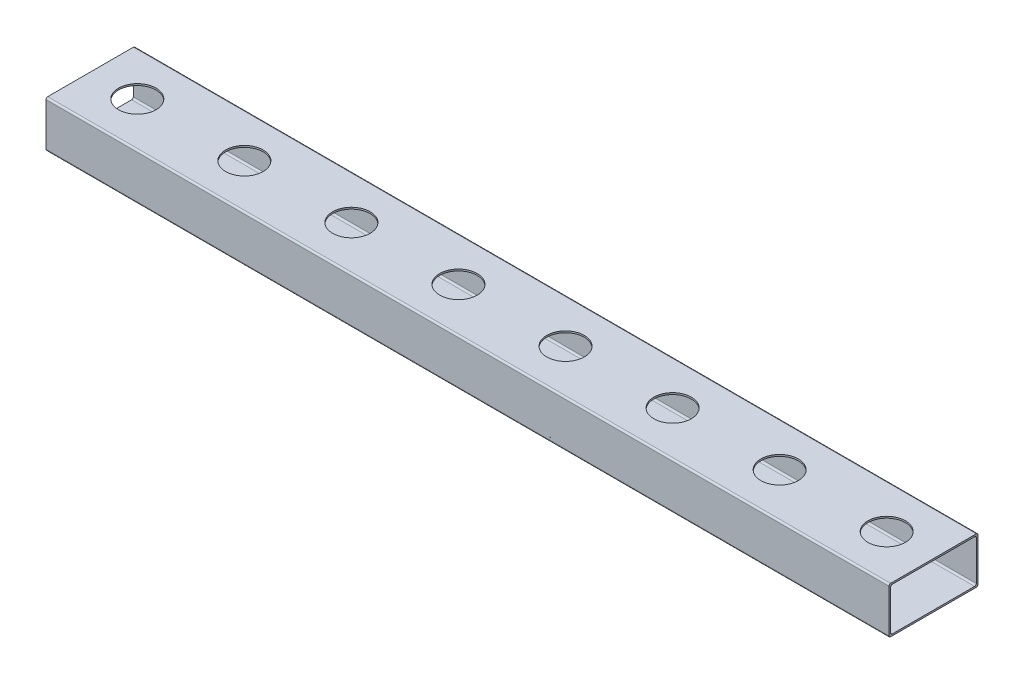
ISO-10303-21;
HEADER;
FILE_DESCRIPTION(('STEP AP214'),'2;1');
FILE_NAME('part.step','',(''),(''),'','','');
FILE_SCHEMA(('AUTOMOTIVE_DESIGN { 1 0 10303 214 1 1 1 1 }'));
ENDSEC;
DATA;
#1=APPLICATION_CONTEXT('core data for automotive mechanical design processes');
#2=APPLICATION_PROTOCOL_DEFINITION('international standard','automotive_design',2000,#1);
#3=PRODUCT_CONTEXT('',#1,'mechanical');
#4=PRODUCT('Part','Part','',(#3));
#5=PRODUCT_RELATED_PRODUCT_CATEGORY('part','',(#4));
#6=PRODUCT_DEFINITION_FORMATION('','',#4);
#7=PRODUCT_DEFINITION_CONTEXT('part definition',#1,'design');
#8=PRODUCT_DEFINITION('design','',#6,#7);
#9=PRODUCT_DEFINITION_SHAPE('','',#8);
#10=(LENGTH_UNIT() NAMED_UNIT(*) SI_UNIT(.MILLI.,.METRE.));
#11=(NAMED_UNIT(*) PLANE_ANGLE_UNIT() SI_UNIT($,.RADIAN.));
#12=(NAMED_UNIT(*) SI_UNIT($,.STERADIAN.) SOLID_ANGLE_UNIT());
#13=UNCERTAINTY_MEASURE_WITH_UNIT(LENGTH_MEASURE(1.E-05),#10,'distance_accuracy_value','');
#14=(GEOMETRIC_REPRESENTATION_CONTEXT(3) GLOBAL_UNCERTAINTY_ASSIGNED_CONTEXT((#13)) GLOBAL_UNIT_ASSIGNED_CONTEXT((#10,
#11,#12)) REPRESENTATION_CONTEXT('',''));
#15=CARTESIAN_POINT('',(0.,0.,0.));
#16=DIRECTION('',(0.,0.,1.));
#17=DIRECTION('',(1.,0.,0.));
#18=AXIS2_PLACEMENT_3D('',#15,#16,#17);
#19=CARTESIAN_POINT('',(500.,27.5,50.85));
#20=DIRECTION('',(0.,-1.,0.));
#21=DIRECTION('',(0.,0.,-1.));
#22=AXIS2_PLACEMENT_3D('',#19,#20,#21);
#23=PLANE('',#22);
#24=CARTESIAN_POINT('',(-190.5,27.5,0.));
#25=DIRECTION('',(0.,1.,0.));
#26=DIRECTION('',(0.,0.,1.));
#27=AXIS2_PLACEMENT_3D('',#24,#25,#26);
#28=CIRCLE('',#27,22.25);
#29=CARTESIAN_POINT('',(-190.5,27.5,22.25));
#30=VERTEX_POINT('',#29);
#31=EDGE_CURVE('E565',#30,#30,#28,.T.);
#32=ORIENTED_EDGE('',*,*,#31,.F.);
#33=EDGE_LOOP('',(#32));
#34=FACE_BOUND('',#33,.T.);
#35=CARTESIAN_POINT('',(63.5,27.5,0.));
#36=DIRECTION('',(0.,1.,0.));
#37=DIRECTION('',(0.,0.,1.));
#38=AXIS2_PLACEMENT_3D('',#35,#36,#37);
#39=CIRCLE('',#38,22.25);
#40=CARTESIAN_POINT('',(63.5,27.5,22.25));
#41=VERTEX_POINT('',#40);
#42=EDGE_CURVE('E577',#41,#41,#39,.T.);
#43=ORIENTED_EDGE('',*,*,#42,.F.);
#44=EDGE_LOOP('',(#43));
#45=FACE_BOUND('',#44,.T.);
#46=CARTESIAN_POINT('',(190.5,27.5,0.));
#47=DIRECTION('',(0.,1.,0.));
#48=DIRECTION('',(0.,0.,1.));
#49=AXIS2_PLACEMENT_3D('',#46,#47,#48);
#50=CIRCLE('',#49,22.25);
#51=CARTESIAN_POINT('',(190.5,27.5,22.25));
#52=VERTEX_POINT('',#51);
#53=EDGE_CURVE('E583',#52,#52,#50,.T.);
#54=ORIENTED_EDGE('',*,*,#53,.F.);
#55=EDGE_LOOP('',(#54));
#56=FACE_BOUND('',#55,.T.);
#57=DIRECTION('',(0.,0.,1.));
#58=VECTOR('',#57,1.);
#59=CARTESIAN_POINT('',(-500.,27.5,50.85));
#60=LINE('',#59,#58);
#61=CARTESIAN_POINT('',(-500.,27.5,-50.85));
#62=VERTEX_POINT('',#61);
#63=CARTESIAN_POINT('',(-500.,27.5,50.85));
#64=VERTEX_POINT('',#63);
#65=EDGE_CURVE('E241',#62,#64,#60,.T.);
#66=ORIENTED_EDGE('',*,*,#65,.T.);
#67=DIRECTION('',(-1.,0.,0.));
#68=VECTOR('',#67,1.);
#69=CARTESIAN_POINT('',(500.,27.5,50.85));
#70=LINE('',#69,#68);
#71=CARTESIAN_POINT('',(500.,27.5,50.85));
#72=VERTEX_POINT('',#71);
#73=EDGE_CURVE('E47',#72,#64,#70,.T.);
#74=ORIENTED_EDGE('',*,*,#73,.F.);
#75=DIRECTION('',(0.,0.,1.));
#76=VECTOR('',#75,1.);
#77=CARTESIAN_POINT('',(500.,27.5,50.85));
#78=LINE('',#77,#76);
#79=CARTESIAN_POINT('',(500.,27.5,-50.85));
#80=VERTEX_POINT('',#79);
#81=EDGE_CURVE('E223',#80,#72,#78,.T.);
#82=ORIENTED_EDGE('',*,*,#81,.F.);
#83=DIRECTION('',(-1.,0.,0.));
#84=VECTOR('',#83,1.);
#85=CARTESIAN_POINT('',(500.,27.5,-50.85));
#86=LINE('',#85,#84);
#87=EDGE_CURVE('E11',#80,#62,#86,.T.);
#88=ORIENTED_EDGE('',*,*,#87,.T.);
#89=EDGE_LOOP('',(#66,#74,#82,#88));
#90=FACE_BOUND('',#89,.T.);
#91=CARTESIAN_POINT('',(444.5,27.5,0.));
#92=DIRECTION('',(0.,1.,0.));
#93=DIRECTION('',(0.,0.,1.));
#94=AXIS2_PLACEMENT_3D('',#91,#92,#93);
#95=CIRCLE('',#94,22.25);
#96=CARTESIAN_POINT('',(444.5,27.5,22.25));
#97=VERTEX_POINT('',#96);
#98=EDGE_CURVE('E595',#97,#97,#95,.T.);
#99=ORIENTED_EDGE('',*,*,#98,.F.);
#100=EDGE_LOOP('',(#99));
#101=FACE_BOUND('',#100,.T.);
#102=CARTESIAN_POINT('',(317.5,27.5,0.));
#103=DIRECTION('',(0.,1.,0.));
#104=DIRECTION('',(0.,0.,1.));
#105=AXIS2_PLACEMENT_3D('',#102,#103,#104);
#106=CIRCLE('',#105,22.25);
#107=CARTESIAN_POINT('',(317.5,27.5,22.25));
#108=VERTEX_POINT('',#107);
#109=EDGE_CURVE('E589',#108,#108,#106,.T.);
#110=ORIENTED_EDGE('',*,*,#109,.F.);
#111=EDGE_LOOP('',(#110));
#112=FACE_BOUND('',#111,.T.);
#113=CARTESIAN_POINT('',(-63.5,27.5,0.));
#114=DIRECTION('',(0.,1.,0.));
#115=DIRECTION('',(0.,0.,1.));
#116=AXIS2_PLACEMENT_3D('',#113,#114,#115);
#117=CIRCLE('',#116,22.25);
#118=CARTESIAN_POINT('',(-63.5,27.5,22.25));
#119=VERTEX_POINT('',#118);
#120=EDGE_CURVE('E571',#119,#119,#117,.T.);
#121=ORIENTED_EDGE('',*,*,#120,.F.);
#122=EDGE_LOOP('',(#121));
#123=FACE_BOUND('',#122,.T.);
#124=CARTESIAN_POINT('',(-317.5,27.5,0.));
#125=DIRECTION('',(0.,1.,0.));
#126=DIRECTION('',(0.,0.,1.));
#127=AXIS2_PLACEMENT_3D('',#124,#125,#126);
#128=CIRCLE('',#127,22.25);
#129=CARTESIAN_POINT('',(-317.5,27.5,22.25));
#130=VERTEX_POINT('',#129);
#131=EDGE_CURVE('E556',#130,#130,#128,.T.);
#132=ORIENTED_EDGE('',*,*,#131,.F.);
#133=EDGE_LOOP('',(#132));
#134=FACE_BOUND('',#133,.T.);
#135=CARTESIAN_POINT('',(-444.5,27.5,0.));
#136=DIRECTION('',(0.,1.,0.));
#137=DIRECTION('',(0.,0.,1.));
#138=AXIS2_PLACEMENT_3D('',#135,#136,#137);
#139=CIRCLE('',#138,22.25);
#140=CARTESIAN_POINT('',(-444.5,27.5,22.25));
#141=VERTEX_POINT('',#140);
#142=EDGE_CURVE('E552',#141,#141,#139,.T.);
#143=ORIENTED_EDGE('',*,*,#142,.F.);
#144=EDGE_LOOP('',(#143));
#145=FACE_BOUND('',#144,.T.);
#146=ADVANCED_FACE('F39',(#34,#45,#56,#90,#101,#112,#123,#134,#145),#23,.F.);
#147=CARTESIAN_POINT('',(500.,25.5,-50.85));
#148=DIRECTION('',(-1.,0.,0.));
#149=DIRECTION('',(0.,0.,1.));
#150=AXIS2_PLACEMENT_3D('',#147,#148,#149);
#151=PLANE('',#150);
#152=CARTESIAN_POINT('',(500.,25.5,-50.85));
#153=DIRECTION('',(1.,0.,0.));
#154=DIRECTION('',(0.,0.,1.));
#155=AXIS2_PLACEMENT_3D('',#152,#153,#154);
#156=CIRCLE('',#155,2.);
#157=CARTESIAN_POINT('',(500.,25.5,-52.85));
#158=VERTEX_POINT('',#157);
#159=EDGE_CURVE('E220',#158,#80,#156,.T.);
#160=ORIENTED_EDGE('',*,*,#159,.T.);
#161=ORIENTED_EDGE('',*,*,#81,.T.);
#162=CARTESIAN_POINT('',(500.,25.5,50.85));
#163=DIRECTION('',(1.,0.,0.));
#164=DIRECTION('',(0.,0.,1.));
#165=AXIS2_PLACEMENT_3D('',#162,#163,#164);
#166=CIRCLE('',#165,2.);
#167=CARTESIAN_POINT('',(500.,25.5,52.85));
#168=VERTEX_POINT('',#167);
#169=EDGE_CURVE('E226',#72,#168,#166,.T.);
#170=ORIENTED_EDGE('',*,*,#169,.T.);
#171=DIRECTION('',(0.,-1.,0.));
#172=VECTOR('',#171,1.);
#173=CARTESIAN_POINT('',(500.,-25.5,52.85));
#174=LINE('',#173,#172);
#175=CARTESIAN_POINT('',(500.,-25.5,52.85));
#176=VERTEX_POINT('',#175);
#177=EDGE_CURVE('E228',#168,#176,#174,.T.);
#178=ORIENTED_EDGE('',*,*,#177,.T.);
#179=CARTESIAN_POINT('',(500.,-25.5,50.85));
#180=DIRECTION('',(1.,0.,0.));
#181=DIRECTION('',(0.,0.,1.));
#182=AXIS2_PLACEMENT_3D('',#179,#180,#181);
#183=CIRCLE('',#182,2.);
#184=CARTESIAN_POINT('',(500.,-27.5,50.85));
#185=VERTEX_POINT('',#184);
#186=EDGE_CURVE('E230',#176,#185,#183,.T.);
#187=ORIENTED_EDGE('',*,*,#186,.T.);
#188=DIRECTION('',(0.,0.,-1.));
#189=VECTOR('',#188,1.);
#190=CARTESIAN_POINT('',(500.,-27.5,50.85));
#191=LINE('',#190,#189);
#192=CARTESIAN_POINT('',(500.,-27.5,-50.85));
#193=VERTEX_POINT('',#192);
#194=EDGE_CURVE('E232',#185,#193,#191,.T.);
#195=ORIENTED_EDGE('',*,*,#194,.T.);
#196=CARTESIAN_POINT('',(500.,-25.5,-50.85));
#197=DIRECTION('',(1.,0.,0.));
#198=DIRECTION('',(0.,0.,-1.));
#199=AXIS2_PLACEMENT_3D('',#196,#197,#198);
#200=CIRCLE('',#199,2.);
#201=CARTESIAN_POINT('',(500.,-25.5,-52.85));
#202=VERTEX_POINT('',#201);
#203=EDGE_CURVE('E234',#193,#202,#200,.T.);
#204=ORIENTED_EDGE('',*,*,#203,.T.);
#205=DIRECTION('',(0.,1.,0.));
#206=VECTOR('',#205,1.);
#207=CARTESIAN_POINT('',(500.,-25.5,-52.85));
#208=LINE('',#207,#206);
#209=EDGE_CURVE('E236',#202,#158,#208,.T.);
#210=ORIENTED_EDGE('',*,*,#209,.T.);
#211=EDGE_LOOP('',(#160,#161,#170,#178,#187,#195,#204,#210));
#212=FACE_BOUND('',#211,.T.);
#213=CARTESIAN_POINT('',(500.,23.5,-48.85));
#214=DIRECTION('',(1.,0.,0.));
#215=DIRECTION('',(0.,0.,1.));
#216=AXIS2_PLACEMENT_3D('',#213,#214,#215);
#217=CIRCLE('',#216,2.00000000000001);
#218=CARTESIAN_POINT('',(500.,23.5,-50.85));
#219=VERTEX_POINT('',#218);
#220=CARTESIAN_POINT('',(500.,25.5,-48.85));
#221=VERTEX_POINT('',#220);
#222=EDGE_CURVE('E152',#219,#221,#217,.T.);
#223=ORIENTED_EDGE('',*,*,#222,.F.);
#224=DIRECTION('',(0.,1.,0.));
#225=VECTOR('',#224,1.);
#226=CARTESIAN_POINT('',(500.,-23.5,-50.85));
#227=LINE('',#226,#225);
#228=CARTESIAN_POINT('',(500.,-23.5,-50.85));
#229=VERTEX_POINT('',#228);
#230=EDGE_CURVE('E187',#229,#219,#227,.T.);
#231=ORIENTED_EDGE('',*,*,#230,.F.);
#232=CARTESIAN_POINT('',(500.,-23.5,-48.85));
#233=DIRECTION('',(1.,0.,0.));
#234=DIRECTION('',(0.,0.,1.));
#235=AXIS2_PLACEMENT_3D('',#232,#233,#234);
#236=CIRCLE('',#235,2.00000000000001);
#237=CARTESIAN_POINT('',(500.,-25.5,-48.85));
#238=VERTEX_POINT('',#237);
#239=EDGE_CURVE('E185',#238,#229,#236,.T.);
#240=ORIENTED_EDGE('',*,*,#239,.F.);
#241=DIRECTION('',(0.,0.,-1.));
#242=VECTOR('',#241,1.);
#243=CARTESIAN_POINT('',(500.,-25.5,48.85));
#244=LINE('',#243,#242);
#245=CARTESIAN_POINT('',(500.,-25.5,48.85));
#246=VERTEX_POINT('',#245);
#247=EDGE_CURVE('E183',#246,#238,#244,.T.);
#248=ORIENTED_EDGE('',*,*,#247,.F.);
#249=CARTESIAN_POINT('',(500.,-23.5,48.85));
#250=DIRECTION('',(1.,0.,0.));
#251=DIRECTION('',(0.,0.,1.));
#252=AXIS2_PLACEMENT_3D('',#249,#250,#251);
#253=CIRCLE('',#252,2.);
#254=CARTESIAN_POINT('',(500.,-23.5,50.85));
#255=VERTEX_POINT('',#254);
#256=EDGE_CURVE('E181',#255,#246,#253,.T.);
#257=ORIENTED_EDGE('',*,*,#256,.F.);
#258=DIRECTION('',(0.,-1.,0.));
#259=VECTOR('',#258,1.);
#260=CARTESIAN_POINT('',(500.,-23.5,50.85));
#261=LINE('',#260,#259);
#262=CARTESIAN_POINT('',(500.,23.5,50.85));
#263=VERTEX_POINT('',#262);
#264=EDGE_CURVE('E176',#263,#255,#261,.T.);
#265=ORIENTED_EDGE('',*,*,#264,.F.);
#266=CARTESIAN_POINT('',(500.,23.5,48.85));
#267=DIRECTION('',(1.,0.,0.));
#268=DIRECTION('',(0.,0.,-1.));
#269=AXIS2_PLACEMENT_3D('',#266,#267,#268);
#270=CIRCLE('',#269,2.);
#271=CARTESIAN_POINT('',(500.,25.5,48.85));
#272=VERTEX_POINT('',#271);
#273=EDGE_CURVE('E174',#272,#263,#270,.T.);
#274=ORIENTED_EDGE('',*,*,#273,.F.);
#275=DIRECTION('',(0.,0.,1.));
#276=VECTOR('',#275,1.);
#277=CARTESIAN_POINT('',(500.,25.5,48.85));
#278=LINE('',#277,#276);
#279=EDGE_CURVE('E160',#221,#272,#278,.T.);
#280=ORIENTED_EDGE('',*,*,#279,.F.);
#281=EDGE_LOOP('',(#223,#231,#240,#248,#257,#265,#274,#280));
#282=FACE_BOUND('',#281,.T.);
#283=ADVANCED_FACE('F172',(#212,#282),#151,.F.);
#284=CARTESIAN_POINT('',(-500.,25.5,-50.85));
#285=DIRECTION('',(-1.,0.,0.));
#286=DIRECTION('',(0.,0.,1.));
#287=AXIS2_PLACEMENT_3D('',#284,#285,#286);
#288=PLANE('',#287);
#289=CARTESIAN_POINT('',(-500.,25.5,-50.85));
#290=DIRECTION('',(1.,0.,0.));
#291=DIRECTION('',(0.,0.,1.));
#292=AXIS2_PLACEMENT_3D('',#289,#290,#291);
#293=CIRCLE('',#292,2.);
#294=CARTESIAN_POINT('',(-500.,25.5,-52.85));
#295=VERTEX_POINT('',#294);
#296=EDGE_CURVE('E168',#295,#62,#293,.T.);
#297=ORIENTED_EDGE('',*,*,#296,.F.);
#298=DIRECTION('',(0.,1.,0.));
#299=VECTOR('',#298,1.);
#300=CARTESIAN_POINT('',(-500.,-25.5,-52.85));
#301=LINE('',#300,#299);
#302=CARTESIAN_POINT('',(-500.,-25.5,-52.85));
#303=VERTEX_POINT('',#302);
#304=EDGE_CURVE('E224',#303,#295,#301,.T.);
#305=ORIENTED_EDGE('',*,*,#304,.F.);
#306=CARTESIAN_POINT('',(-500.,-25.5,-50.85));
#307=DIRECTION('',(1.,0.,0.));
#308=DIRECTION('',(0.,0.,-1.));
#309=AXIS2_PLACEMENT_3D('',#306,#307,#308);
#310=CIRCLE('',#309,2.);
#311=CARTESIAN_POINT('',(-500.,-27.5,-50.85));
#312=VERTEX_POINT('',#311);
#313=EDGE_CURVE('E251',#312,#303,#310,.T.);
#314=ORIENTED_EDGE('',*,*,#313,.F.);
#315=DIRECTION('',(0.,0.,-1.));
#316=VECTOR('',#315,1.);
#317=CARTESIAN_POINT('',(-500.,-27.5,50.85));
#318=LINE('',#317,#316);
#319=CARTESIAN_POINT('',(-500.,-27.5,50.85));
#320=VERTEX_POINT('',#319);
#321=EDGE_CURVE('E249',#320,#312,#318,.T.);
#322=ORIENTED_EDGE('',*,*,#321,.F.);
#323=CARTESIAN_POINT('',(-500.,-25.5,50.85));
#324=DIRECTION('',(1.,0.,0.));
#325=DIRECTION('',(0.,0.,1.));
#326=AXIS2_PLACEMENT_3D('',#323,#324,#325);
#327=CIRCLE('',#326,2.);
#328=CARTESIAN_POINT('',(-500.,-25.5,52.85));
#329=VERTEX_POINT('',#328);
#330=EDGE_CURVE('E247',#329,#320,#327,.T.);
#331=ORIENTED_EDGE('',*,*,#330,.F.);
#332=DIRECTION('',(0.,-1.,0.));
#333=VECTOR('',#332,1.);
#334=CARTESIAN_POINT('',(-500.,-25.5,52.85));
#335=LINE('',#334,#333);
#336=CARTESIAN_POINT('',(-500.,25.5,52.85));
#337=VERTEX_POINT('',#336);
#338=EDGE_CURVE('E245',#337,#329,#335,.T.);
#339=ORIENTED_EDGE('',*,*,#338,.F.);
#340=CARTESIAN_POINT('',(-500.,25.5,50.85));
#341=DIRECTION('',(1.,0.,0.));
#342=DIRECTION('',(0.,0.,1.));
#343=AXIS2_PLACEMENT_3D('',#340,#341,#342);
#344=CIRCLE('',#343,2.);
#345=EDGE_CURVE('E243',#64,#337,#344,.T.);
#346=ORIENTED_EDGE('',*,*,#345,.F.);
#347=ORIENTED_EDGE('',*,*,#65,.F.);
#348=EDGE_LOOP('',(#297,#305,#314,#322,#331,#339,#346,#347));
#349=FACE_BOUND('',#348,.T.);
#350=DIRECTION('',(0.,1.,0.));
#351=VECTOR('',#350,1.);
#352=CARTESIAN_POINT('',(-500.,-23.5,-50.85));
#353=LINE('',#352,#351);
#354=CARTESIAN_POINT('',(-500.,-23.5,-50.85));
#355=VERTEX_POINT('',#354);
#356=CARTESIAN_POINT('',(-500.,23.5,-50.85));
#357=VERTEX_POINT('',#356);
#358=EDGE_CURVE('E161',#355,#357,#353,.T.);
#359=ORIENTED_EDGE('',*,*,#358,.T.);
#360=CARTESIAN_POINT('',(-500.,23.5,-48.85));
#361=DIRECTION('',(1.,0.,0.));
#362=DIRECTION('',(0.,0.,1.));
#363=AXIS2_PLACEMENT_3D('',#360,#361,#362);
#364=CIRCLE('',#363,2.00000000000001);
#365=CARTESIAN_POINT('',(-500.,25.5,-48.85));
#366=VERTEX_POINT('',#365);
#367=EDGE_CURVE('E62',#357,#366,#364,.T.);
#368=ORIENTED_EDGE('',*,*,#367,.T.);
#369=DIRECTION('',(0.,0.,1.));
#370=VECTOR('',#369,1.);
#371=CARTESIAN_POINT('',(-500.,25.5,48.85));
#372=LINE('',#371,#370);
#373=CARTESIAN_POINT('',(-500.,25.5,48.85));
#374=VERTEX_POINT('',#373);
#375=EDGE_CURVE('E167',#366,#374,#372,.T.);
#376=ORIENTED_EDGE('',*,*,#375,.T.);
#377=CARTESIAN_POINT('',(-500.,23.5,48.85));
#378=DIRECTION('',(1.,0.,0.));
#379=DIRECTION('',(0.,0.,-1.));
#380=AXIS2_PLACEMENT_3D('',#377,#378,#379);
#381=CIRCLE('',#380,2.);
#382=CARTESIAN_POINT('',(-500.,23.5,50.85));
#383=VERTEX_POINT('',#382);
#384=EDGE_CURVE('E192',#374,#383,#381,.T.);
#385=ORIENTED_EDGE('',*,*,#384,.T.);
#386=DIRECTION('',(0.,-1.,0.));
#387=VECTOR('',#386,1.);
#388=CARTESIAN_POINT('',(-500.,-23.5,50.85));
#389=LINE('',#388,#387);
#390=CARTESIAN_POINT('',(-500.,-23.5,50.85));
#391=VERTEX_POINT('',#390);
#392=EDGE_CURVE('E195',#383,#391,#389,.T.);
#393=ORIENTED_EDGE('',*,*,#392,.T.);
#394=CARTESIAN_POINT('',(-500.,-23.5,48.85));
#395=DIRECTION('',(1.,0.,0.));
#396=DIRECTION('',(0.,0.,1.));
#397=AXIS2_PLACEMENT_3D('',#394,#395,#396);
#398=CIRCLE('',#397,2.);
#399=CARTESIAN_POINT('',(-500.,-25.5,48.85));
#400=VERTEX_POINT('',#399);
#401=EDGE_CURVE('E198',#391,#400,#398,.T.);
#402=ORIENTED_EDGE('',*,*,#401,.T.);
#403=DIRECTION('',(0.,0.,-1.));
#404=VECTOR('',#403,1.);
#405=CARTESIAN_POINT('',(-500.,-25.5,48.85));
#406=LINE('',#405,#404);
#407=CARTESIAN_POINT('',(-500.,-25.5,-48.85));
#408=VERTEX_POINT('',#407);
#409=EDGE_CURVE('E201',#400,#408,#406,.T.);
#410=ORIENTED_EDGE('',*,*,#409,.T.);
#411=CARTESIAN_POINT('',(-500.,-23.5,-48.85));
#412=DIRECTION('',(1.,0.,0.));
#413=DIRECTION('',(0.,0.,1.));
#414=AXIS2_PLACEMENT_3D('',#411,#412,#413);
#415=CIRCLE('',#414,2.00000000000001);
#416=EDGE_CURVE('E204',#408,#355,#415,.T.);
#417=ORIENTED_EDGE('',*,*,#416,.T.);
#418=EDGE_LOOP('',(#359,#368,#376,#385,#393,#402,#410,#417));
#419=FACE_BOUND('',#418,.T.);
#420=ADVANCED_FACE('F281',(#349,#419),#288,.T.);
#421=CARTESIAN_POINT('',(500.,25.5,-50.85));
#422=DIRECTION('',(-1.,0.,0.));
#423=DIRECTION('',(0.,0.,1.));
#424=AXIS2_PLACEMENT_3D('',#421,#422,#423);
#425=CYLINDRICAL_SURFACE('',#424,2.);
#426=ORIENTED_EDGE('',*,*,#296,.T.);
#427=ORIENTED_EDGE('',*,*,#87,.F.);
#428=ORIENTED_EDGE('',*,*,#159,.F.);
#429=DIRECTION('',(-1.,0.,0.));
#430=VECTOR('',#429,1.);
#431=CARTESIAN_POINT('',(500.,25.5,-52.85));
#432=LINE('',#431,#430);
#433=EDGE_CURVE('E238',#158,#295,#432,.T.);
#434=ORIENTED_EDGE('',*,*,#433,.T.);
#435=EDGE_LOOP('',(#426,#427,#428,#434));
#436=FACE_BOUND('',#435,.T.);
#437=ADVANCED_FACE('F41',(#436),#425,.T.);
#438=CARTESIAN_POINT('',(500.,25.5,50.85));
#439=DIRECTION('',(-1.,0.,0.));
#440=DIRECTION('',(0.,0.,1.));
#441=AXIS2_PLACEMENT_3D('',#438,#439,#440);
#442=CYLINDRICAL_SURFACE('',#441,2.);
#443=ORIENTED_EDGE('',*,*,#345,.T.);
#444=DIRECTION('',(-1.,0.,0.));
#445=VECTOR('',#444,1.);
#446=CARTESIAN_POINT('',(500.,25.5,52.85));
#447=LINE('',#446,#445);
#448=EDGE_CURVE('E268',#168,#337,#447,.T.);
#449=ORIENTED_EDGE('',*,*,#448,.F.);
#450=ORIENTED_EDGE('',*,*,#169,.F.);
#451=ORIENTED_EDGE('',*,*,#73,.T.);
#452=EDGE_LOOP('',(#443,#449,#450,#451));
#453=FACE_BOUND('',#452,.T.);
#454=ADVANCED_FACE('F275',(#453),#442,.T.);
#455=CARTESIAN_POINT('',(500.,-25.5,52.85));
#456=DIRECTION('',(0.,0.,-1.));
#457=DIRECTION('',(-1.,0.,0.));
#458=AXIS2_PLACEMENT_3D('',#455,#456,#457);
#459=PLANE('',#458);
#460=ORIENTED_EDGE('',*,*,#338,.T.);
#461=DIRECTION('',(-1.,0.,0.));
#462=VECTOR('',#461,1.);
#463=CARTESIAN_POINT('',(500.,-25.5,52.85));
#464=LINE('',#463,#462);
#465=EDGE_CURVE('E265',#176,#329,#464,.T.);
#466=ORIENTED_EDGE('',*,*,#465,.F.);
#467=ORIENTED_EDGE('',*,*,#177,.F.);
#468=ORIENTED_EDGE('',*,*,#448,.T.);
#469=EDGE_LOOP('',(#460,#466,#467,#468));
#470=FACE_BOUND('',#469,.T.);
#471=ADVANCED_FACE('F287',(#470),#459,.F.);
#472=CARTESIAN_POINT('',(500.,-25.5,50.85));
#473=DIRECTION('',(-1.,0.,0.));
#474=DIRECTION('',(0.,0.,1.));
#475=AXIS2_PLACEMENT_3D('',#472,#473,#474);
#476=CYLINDRICAL_SURFACE('',#475,2.);
#477=ORIENTED_EDGE('',*,*,#330,.T.);
#478=DIRECTION('',(-1.,0.,0.));
#479=VECTOR('',#478,1.);
#480=CARTESIAN_POINT('',(500.,-27.5,50.85));
#481=LINE('',#480,#479);
#482=EDGE_CURVE('E262',#185,#320,#481,.T.);
#483=ORIENTED_EDGE('',*,*,#482,.F.);
#484=ORIENTED_EDGE('',*,*,#186,.F.);
#485=ORIENTED_EDGE('',*,*,#465,.T.);
#486=EDGE_LOOP('',(#477,#483,#484,#485));
#487=FACE_BOUND('',#486,.T.);
#488=ADVANCED_FACE('F291',(#487),#476,.T.);
#489=CARTESIAN_POINT('',(500.,-27.5,50.85));
#490=DIRECTION('',(0.,1.,0.));
#491=DIRECTION('',(0.,0.,1.));
#492=AXIS2_PLACEMENT_3D('',#489,#490,#491);
#493=PLANE('',#492);
#494=ORIENTED_EDGE('',*,*,#321,.T.);
#495=DIRECTION('',(-1.,0.,0.));
#496=VECTOR('',#495,1.);
#497=CARTESIAN_POINT('',(500.,-27.5,-50.85));
#498=LINE('',#497,#496);
#499=EDGE_CURVE('E259',#193,#312,#498,.T.);
#500=ORIENTED_EDGE('',*,*,#499,.F.);
#501=ORIENTED_EDGE('',*,*,#194,.F.);
#502=ORIENTED_EDGE('',*,*,#482,.T.);
#503=EDGE_LOOP('',(#494,#500,#501,#502));
#504=FACE_BOUND('',#503,.T.);
#505=ADVANCED_FACE('F311',(#504),#493,.F.);
#506=CARTESIAN_POINT('',(500.,-25.5,-50.85));
#507=DIRECTION('',(-1.,0.,0.));
#508=DIRECTION('',(0.,0.,1.));
#509=AXIS2_PLACEMENT_3D('',#506,#507,#508);
#510=CYLINDRICAL_SURFACE('',#509,2.);
#511=ORIENTED_EDGE('',*,*,#313,.T.);
#512=DIRECTION('',(-1.,0.,0.));
#513=VECTOR('',#512,1.);
#514=CARTESIAN_POINT('',(500.,-25.5,-52.85));
#515=LINE('',#514,#513);
#516=EDGE_CURVE('E256',#202,#303,#515,.T.);
#517=ORIENTED_EDGE('',*,*,#516,.F.);
#518=ORIENTED_EDGE('',*,*,#203,.F.);
#519=ORIENTED_EDGE('',*,*,#499,.T.);
#520=EDGE_LOOP('',(#511,#517,#518,#519));
#521=FACE_BOUND('',#520,.T.);
#522=ADVANCED_FACE('F309',(#521),#510,.T.);
#523=CARTESIAN_POINT('',(500.,-25.5,-52.85));
#524=DIRECTION('',(0.,0.,1.));
#525=DIRECTION('',(1.,0.,0.));
#526=AXIS2_PLACEMENT_3D('',#523,#524,#525);
#527=PLANE('',#526);
#528=ORIENTED_EDGE('',*,*,#304,.T.);
#529=ORIENTED_EDGE('',*,*,#433,.F.);
#530=ORIENTED_EDGE('',*,*,#209,.F.);
#531=ORIENTED_EDGE('',*,*,#516,.T.);
#532=EDGE_LOOP('',(#528,#529,#530,#531));
#533=FACE_BOUND('',#532,.T.);
#534=ADVANCED_FACE('F304',(#533),#527,.F.);
#535=CARTESIAN_POINT('',(500.,23.5,-48.85));
#536=DIRECTION('',(-1.,0.,0.));
#537=DIRECTION('',(0.,0.,1.));
#538=AXIS2_PLACEMENT_3D('',#535,#536,#537);
#539=CYLINDRICAL_SURFACE('',#538,2.00000000000001);
#540=ORIENTED_EDGE('',*,*,#367,.F.);
#541=DIRECTION('',(-1.,0.,0.));
#542=VECTOR('',#541,1.);
#543=CARTESIAN_POINT('',(500.,23.5,-50.85));
#544=LINE('',#543,#542);
#545=EDGE_CURVE('E156',#219,#357,#544,.T.);
#546=ORIENTED_EDGE('',*,*,#545,.F.);
#547=ORIENTED_EDGE('',*,*,#222,.T.);
#548=DIRECTION('',(-1.,0.,0.));
#549=VECTOR('',#548,1.);
#550=CARTESIAN_POINT('',(500.,25.5,-48.85));
#551=LINE('',#550,#549);
#552=EDGE_CURVE('E155',#221,#366,#551,.T.);
#553=ORIENTED_EDGE('',*,*,#552,.T.);
#554=EDGE_LOOP('',(#540,#546,#547,#553));
#555=FACE_BOUND('',#554,.T.);
#556=ADVANCED_FACE('F154',(#555),#539,.F.);
#557=CARTESIAN_POINT('',(500.,25.5,48.85));
#558=DIRECTION('',(0.,-1.,0.));
#559=DIRECTION('',(0.,0.,-1.));
#560=AXIS2_PLACEMENT_3D('',#557,#558,#559);
#561=PLANE('',#560);
#562=CARTESIAN_POINT('',(-444.5,25.5,0.));
#563=DIRECTION('',(0.,-1.,0.));
#564=DIRECTION('',(0.,0.,-1.));
#565=AXIS2_PLACEMENT_3D('',#562,#563,#564);
#566=CIRCLE('',#565,22.25);
#567=CARTESIAN_POINT('',(-444.5,25.5,-22.25));
#568=VERTEX_POINT('',#567);
#569=EDGE_CURVE('E555',#568,#568,#566,.T.);
#570=ORIENTED_EDGE('',*,*,#569,.F.);
#571=EDGE_LOOP('',(#570));
#572=FACE_BOUND('',#571,.T.);
#573=CARTESIAN_POINT('',(-317.5,25.5,0.));
#574=DIRECTION('',(0.,-1.,0.));
#575=DIRECTION('',(0.,0.,-1.));
#576=AXIS2_PLACEMENT_3D('',#573,#574,#575);
#577=CIRCLE('',#576,22.25);
#578=CARTESIAN_POINT('',(-317.5,25.5,-22.25));
#579=VERTEX_POINT('',#578);
#580=EDGE_CURVE('E559',#579,#579,#577,.T.);
#581=ORIENTED_EDGE('',*,*,#580,.F.);
#582=EDGE_LOOP('',(#581));
#583=FACE_BOUND('',#582,.T.);
#584=CARTESIAN_POINT('',(-190.5,25.5,0.));
#585=DIRECTION('',(0.,-1.,0.));
#586=DIRECTION('',(0.,0.,-1.));
#587=AXIS2_PLACEMENT_3D('',#584,#585,#586);
#588=CIRCLE('',#587,22.25);
#589=CARTESIAN_POINT('',(-190.5,25.5,-22.25));
#590=VERTEX_POINT('',#589);
#591=EDGE_CURVE('E568',#590,#590,#588,.T.);
#592=ORIENTED_EDGE('',*,*,#591,.F.);
#593=EDGE_LOOP('',(#592));
#594=FACE_BOUND('',#593,.T.);
#595=CARTESIAN_POINT('',(-63.5,25.5,0.));
#596=DIRECTION('',(0.,-1.,0.));
#597=DIRECTION('',(0.,0.,-1.));
#598=AXIS2_PLACEMENT_3D('',#595,#596,#597);
#599=CIRCLE('',#598,22.25);
#600=CARTESIAN_POINT('',(-63.5,25.5,-22.25));
#601=VERTEX_POINT('',#600);
#602=EDGE_CURVE('E574',#601,#601,#599,.T.);
#603=ORIENTED_EDGE('',*,*,#602,.F.);
#604=EDGE_LOOP('',(#603));
#605=FACE_BOUND('',#604,.T.);
#606=CARTESIAN_POINT('',(63.5,25.5,0.));
#607=DIRECTION('',(0.,-1.,0.));
#608=DIRECTION('',(0.,0.,-1.));
#609=AXIS2_PLACEMENT_3D('',#606,#607,#608);
#610=CIRCLE('',#609,22.25);
#611=CARTESIAN_POINT('',(63.5,25.5,-22.25));
#612=VERTEX_POINT('',#611);
#613=EDGE_CURVE('E580',#612,#612,#610,.T.);
#614=ORIENTED_EDGE('',*,*,#613,.F.);
#615=EDGE_LOOP('',(#614));
#616=FACE_BOUND('',#615,.T.);
#617=CARTESIAN_POINT('',(190.5,25.5,0.));
#618=DIRECTION('',(0.,-1.,0.));
#619=DIRECTION('',(0.,0.,-1.));
#620=AXIS2_PLACEMENT_3D('',#617,#618,#619);
#621=CIRCLE('',#620,22.25);
#622=CARTESIAN_POINT('',(190.5,25.5,-22.25));
#623=VERTEX_POINT('',#622);
#624=EDGE_CURVE('E586',#623,#623,#621,.T.);
#625=ORIENTED_EDGE('',*,*,#624,.F.);
#626=EDGE_LOOP('',(#625));
#627=FACE_BOUND('',#626,.T.);
#628=CARTESIAN_POINT('',(317.5,25.5,0.));
#629=DIRECTION('',(0.,-1.,0.));
#630=DIRECTION('',(0.,0.,-1.));
#631=AXIS2_PLACEMENT_3D('',#628,#629,#630);
#632=CIRCLE('',#631,22.25);
#633=CARTESIAN_POINT('',(317.5,25.5,-22.25));
#634=VERTEX_POINT('',#633);
#635=EDGE_CURVE('E592',#634,#634,#632,.T.);
#636=ORIENTED_EDGE('',*,*,#635,.F.);
#637=EDGE_LOOP('',(#636));
#638=FACE_BOUND('',#637,.T.);
#639=CARTESIAN_POINT('',(444.5,25.5,0.));
#640=DIRECTION('',(0.,-1.,0.));
#641=DIRECTION('',(0.,0.,-1.));
#642=AXIS2_PLACEMENT_3D('',#639,#640,#641);
#643=CIRCLE('',#642,22.25);
#644=CARTESIAN_POINT('',(444.5,25.5,-22.25));
#645=VERTEX_POINT('',#644);
#646=EDGE_CURVE('E190',#645,#645,#643,.T.);
#647=ORIENTED_EDGE('',*,*,#646,.F.);
#648=EDGE_LOOP('',(#647));
#649=FACE_BOUND('',#648,.T.);
#650=ORIENTED_EDGE('',*,*,#375,.F.);
#651=ORIENTED_EDGE('',*,*,#552,.F.);
#652=ORIENTED_EDGE('',*,*,#279,.T.);
#653=DIRECTION('',(-1.,0.,0.));
#654=VECTOR('',#653,1.);
#655=CARTESIAN_POINT('',(500.,25.5,48.85));
#656=LINE('',#655,#654);
#657=EDGE_CURVE('E169',#272,#374,#656,.T.);
#658=ORIENTED_EDGE('',*,*,#657,.T.);
#659=EDGE_LOOP('',(#650,#651,#652,#658));
#660=FACE_BOUND('',#659,.T.);
#661=ADVANCED_FACE('F164',(#572,#583,#594,#605,#616,#627,#638,#649,#660),#561,.T.);
#662=CARTESIAN_POINT('',(500.,23.5,48.85));
#663=DIRECTION('',(-1.,0.,0.));
#664=DIRECTION('',(0.,0.,1.));
#665=AXIS2_PLACEMENT_3D('',#662,#663,#664);
#666=CYLINDRICAL_SURFACE('',#665,2.);
#667=ORIENTED_EDGE('',*,*,#384,.F.);
#668=ORIENTED_EDGE('',*,*,#657,.F.);
#669=ORIENTED_EDGE('',*,*,#273,.T.);
#670=DIRECTION('',(-1.,0.,0.));
#671=VECTOR('',#670,1.);
#672=CARTESIAN_POINT('',(500.,23.5,50.85));
#673=LINE('',#672,#671);
#674=EDGE_CURVE('E217',#263,#383,#673,.T.);
#675=ORIENTED_EDGE('',*,*,#674,.T.);
#676=EDGE_LOOP('',(#667,#668,#669,#675));
#677=FACE_BOUND('',#676,.T.);
#678=ADVANCED_FACE('F380',(#677),#666,.F.);
#679=CARTESIAN_POINT('',(500.,-23.5,50.85));
#680=DIRECTION('',(0.,0.,-1.));
#681=DIRECTION('',(-1.,0.,0.));
#682=AXIS2_PLACEMENT_3D('',#679,#680,#681);
#683=PLANE('',#682);
#684=ORIENTED_EDGE('',*,*,#392,.F.);
#685=ORIENTED_EDGE('',*,*,#674,.F.);
#686=ORIENTED_EDGE('',*,*,#264,.T.);
#687=DIRECTION('',(-1.,0.,0.));
#688=VECTOR('',#687,1.);
#689=CARTESIAN_POINT('',(500.,-23.5,50.85));
#690=LINE('',#689,#688);
#691=EDGE_CURVE('E215',#255,#391,#690,.T.);
#692=ORIENTED_EDGE('',*,*,#691,.T.);
#693=EDGE_LOOP('',(#684,#685,#686,#692));
#694=FACE_BOUND('',#693,.T.);
#695=ADVANCED_FACE('F390',(#694),#683,.T.);
#696=CARTESIAN_POINT('',(500.,-23.5,48.85));
#697=DIRECTION('',(-1.,0.,0.));
#698=DIRECTION('',(0.,0.,1.));
#699=AXIS2_PLACEMENT_3D('',#696,#697,#698);
#700=CYLINDRICAL_SURFACE('',#699,2.);
#701=ORIENTED_EDGE('',*,*,#401,.F.);
#702=ORIENTED_EDGE('',*,*,#691,.F.);
#703=ORIENTED_EDGE('',*,*,#256,.T.);
#704=DIRECTION('',(-1.,0.,0.));
#705=VECTOR('',#704,1.);
#706=CARTESIAN_POINT('',(500.,-25.5,48.85));
#707=LINE('',#706,#705);
#708=EDGE_CURVE('E213',#246,#400,#707,.T.);
#709=ORIENTED_EDGE('',*,*,#708,.T.);
#710=EDGE_LOOP('',(#701,#702,#703,#709));
#711=FACE_BOUND('',#710,.T.);
#712=ADVANCED_FACE('F400',(#711),#700,.F.);
#713=CARTESIAN_POINT('',(500.,-25.5,48.85));
#714=DIRECTION('',(0.,1.,0.));
#715=DIRECTION('',(0.,0.,1.));
#716=AXIS2_PLACEMENT_3D('',#713,#714,#715);
#717=PLANE('',#716);
#718=ORIENTED_EDGE('',*,*,#409,.F.);
#719=ORIENTED_EDGE('',*,*,#708,.F.);
#720=ORIENTED_EDGE('',*,*,#247,.T.);
#721=DIRECTION('',(-1.,0.,0.));
#722=VECTOR('',#721,1.);
#723=CARTESIAN_POINT('',(500.,-25.5,-48.85));
#724=LINE('',#723,#722);
#725=EDGE_CURVE('E211',#238,#408,#724,.T.);
#726=ORIENTED_EDGE('',*,*,#725,.T.);
#727=EDGE_LOOP('',(#718,#719,#720,#726));
#728=FACE_BOUND('',#727,.T.);
#729=ADVANCED_FACE('F410',(#728),#717,.T.);
#730=CARTESIAN_POINT('',(500.,-23.5,-48.85));
#731=DIRECTION('',(-1.,0.,0.));
#732=DIRECTION('',(0.,0.,1.));
#733=AXIS2_PLACEMENT_3D('',#730,#731,#732);
#734=CYLINDRICAL_SURFACE('',#733,2.00000000000001);
#735=ORIENTED_EDGE('',*,*,#416,.F.);
#736=ORIENTED_EDGE('',*,*,#725,.F.);
#737=ORIENTED_EDGE('',*,*,#239,.T.);
#738=DIRECTION('',(-1.,0.,0.));
#739=VECTOR('',#738,1.);
#740=CARTESIAN_POINT('',(500.,-23.5,-50.85));
#741=LINE('',#740,#739);
#742=EDGE_CURVE('E54',#229,#355,#741,.T.);
#743=ORIENTED_EDGE('',*,*,#742,.T.);
#744=EDGE_LOOP('',(#735,#736,#737,#743));
#745=FACE_BOUND('',#744,.T.);
#746=ADVANCED_FACE('F420',(#745),#734,.F.);
#747=CARTESIAN_POINT('',(500.,-23.5,-50.85));
#748=DIRECTION('',(0.,0.,1.));
#749=DIRECTION('',(1.,0.,0.));
#750=AXIS2_PLACEMENT_3D('',#747,#748,#749);
#751=PLANE('',#750);
#752=ORIENTED_EDGE('',*,*,#358,.F.);
#753=ORIENTED_EDGE('',*,*,#742,.F.);
#754=ORIENTED_EDGE('',*,*,#230,.T.);
#755=ORIENTED_EDGE('',*,*,#545,.T.);
#756=EDGE_LOOP('',(#752,#753,#754,#755));
#757=FACE_BOUND('',#756,.T.);
#758=ADVANCED_FACE('F430',(#757),#751,.T.);
#759=CARTESIAN_POINT('',(444.5,27.5,0.));
#760=DIRECTION('',(0.,1.,0.));
#761=DIRECTION('',(0.,0.,1.));
#762=AXIS2_PLACEMENT_3D('',#759,#760,#761);
#763=CYLINDRICAL_SURFACE('',#762,22.25);
#764=ORIENTED_EDGE('',*,*,#98,.T.);
#765=EDGE_LOOP('',(#764));
#766=FACE_BOUND('',#765,.T.);
#767=ORIENTED_EDGE('',*,*,#646,.T.);
#768=EDGE_LOOP('',(#767));
#769=FACE_BOUND('',#768,.T.);
#770=ADVANCED_FACE('F439',(#766,#769),#763,.F.);
#771=CARTESIAN_POINT('',(317.5,27.5,0.));
#772=DIRECTION('',(0.,1.,0.));
#773=DIRECTION('',(0.,0.,1.));
#774=AXIS2_PLACEMENT_3D('',#771,#772,#773);
#775=CYLINDRICAL_SURFACE('',#774,22.25);
#776=ORIENTED_EDGE('',*,*,#109,.T.);
#777=EDGE_LOOP('',(#776));
#778=FACE_BOUND('',#777,.T.);
#779=ORIENTED_EDGE('',*,*,#635,.T.);
#780=EDGE_LOOP('',(#779));
#781=FACE_BOUND('',#780,.T.);
#782=ADVANCED_FACE('F451',(#778,#781),#775,.F.);
#783=CARTESIAN_POINT('',(190.5,27.5,0.));
#784=DIRECTION('',(0.,1.,0.));
#785=DIRECTION('',(0.,0.,1.));
#786=AXIS2_PLACEMENT_3D('',#783,#784,#785);
#787=CYLINDRICAL_SURFACE('',#786,22.25);
#788=ORIENTED_EDGE('',*,*,#53,.T.);
#789=EDGE_LOOP('',(#788));
#790=FACE_BOUND('',#789,.T.);
#791=ORIENTED_EDGE('',*,*,#624,.T.);
#792=EDGE_LOOP('',(#791));
#793=FACE_BOUND('',#792,.T.);
#794=ADVANCED_FACE('F461',(#790,#793),#787,.F.);
#795=CARTESIAN_POINT('',(63.5,27.5,0.));
#796=DIRECTION('',(0.,1.,0.));
#797=DIRECTION('',(0.,0.,1.));
#798=AXIS2_PLACEMENT_3D('',#795,#796,#797);
#799=CYLINDRICAL_SURFACE('',#798,22.25);
#800=ORIENTED_EDGE('',*,*,#42,.T.);
#801=EDGE_LOOP('',(#800));
#802=FACE_BOUND('',#801,.T.);
#803=ORIENTED_EDGE('',*,*,#613,.T.);
#804=EDGE_LOOP('',(#803));
#805=FACE_BOUND('',#804,.T.);
#806=ADVANCED_FACE('F471',(#802,#805),#799,.F.);
#807=CARTESIAN_POINT('',(-63.5,27.5,0.));
#808=DIRECTION('',(0.,1.,0.));
#809=DIRECTION('',(0.,0.,1.));
#810=AXIS2_PLACEMENT_3D('',#807,#808,#809);
#811=CYLINDRICAL_SURFACE('',#810,22.25);
#812=ORIENTED_EDGE('',*,*,#120,.T.);
#813=EDGE_LOOP('',(#812));
#814=FACE_BOUND('',#813,.T.);
#815=ORIENTED_EDGE('',*,*,#602,.T.);
#816=EDGE_LOOP('',(#815));
#817=FACE_BOUND('',#816,.T.);
#818=ADVANCED_FACE('F481',(#814,#817),#811,.F.);
#819=CARTESIAN_POINT('',(-190.5,27.5,0.));
#820=DIRECTION('',(0.,1.,0.));
#821=DIRECTION('',(0.,0.,1.));
#822=AXIS2_PLACEMENT_3D('',#819,#820,#821);
#823=CYLINDRICAL_SURFACE('',#822,22.25);
#824=ORIENTED_EDGE('',*,*,#31,.T.);
#825=EDGE_LOOP('',(#824));
#826=FACE_BOUND('',#825,.T.);
#827=ORIENTED_EDGE('',*,*,#591,.T.);
#828=EDGE_LOOP('',(#827));
#829=FACE_BOUND('',#828,.T.);
#830=ADVANCED_FACE('F491',(#826,#829),#823,.F.);
#831=CARTESIAN_POINT('',(-317.5,27.5,0.));
#832=DIRECTION('',(0.,1.,0.));
#833=DIRECTION('',(0.,0.,1.));
#834=AXIS2_PLACEMENT_3D('',#831,#832,#833);
#835=CYLINDRICAL_SURFACE('',#834,22.25);
#836=ORIENTED_EDGE('',*,*,#131,.T.);
#837=EDGE_LOOP('',(#836));
#838=FACE_BOUND('',#837,.T.);
#839=ORIENTED_EDGE('',*,*,#580,.T.);
#840=EDGE_LOOP('',(#839));
#841=FACE_BOUND('',#840,.T.);
#842=ADVANCED_FACE('F501',(#838,#841),#835,.F.);
#843=CARTESIAN_POINT('',(-444.5,27.5,0.));
#844=DIRECTION('',(0.,1.,0.));
#845=DIRECTION('',(0.,0.,1.));
#846=AXIS2_PLACEMENT_3D('',#843,#844,#845);
#847=CYLINDRICAL_SURFACE('',#846,22.25);
#848=ORIENTED_EDGE('',*,*,#142,.T.);
#849=EDGE_LOOP('',(#848));
#850=FACE_BOUND('',#849,.T.);
#851=ORIENTED_EDGE('',*,*,#569,.T.);
#852=EDGE_LOOP('',(#851));
#853=FACE_BOUND('',#852,.T.);
#854=ADVANCED_FACE('F511',(#850,#853),#847,.F.);
#855=CLOSED_SHELL('',(#146,#283,#420,#437,#454,#471,#488,#505,#522,#534,#556,#661,#678,#695,
#712,#729,#746,#758,#770,#782,#794,#806,#818,#830,#842,#854));
#856=MANIFOLD_SOLID_BREP('B2',#855);
#857=ADVANCED_BREP_SHAPE_REPRESENTATION('',(#18,#856),#14);
#858=SHAPE_DEFINITION_REPRESENTATION(#9,#857);
ENDSEC;
END-ISO-10303-21;
